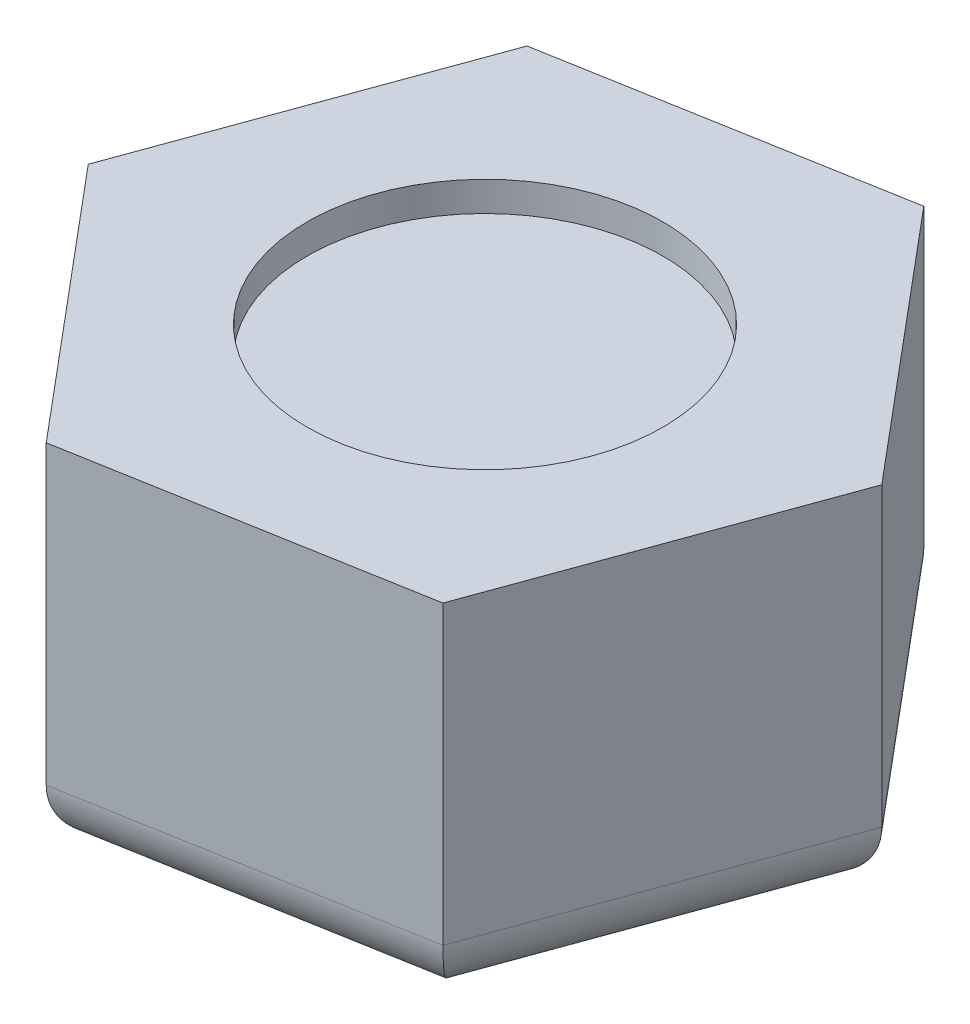
ISO-10303-21;
HEADER;
FILE_DESCRIPTION(('STEP AP214'),'2;1');
FILE_NAME('part.step','',(''),(''),'','','');
FILE_SCHEMA(('AUTOMOTIVE_DESIGN { 1 0 10303 214 1 1 1 1 }'));
ENDSEC;
DATA;
#1=APPLICATION_CONTEXT('core data for automotive mechanical design processes');
#2=APPLICATION_PROTOCOL_DEFINITION('international standard','automotive_design',2000,#1);
#3=PRODUCT_CONTEXT('',#1,'mechanical');
#4=PRODUCT('Part','Part','',(#3));
#5=PRODUCT_RELATED_PRODUCT_CATEGORY('part','',(#4));
#6=PRODUCT_DEFINITION_FORMATION('','',#4);
#7=PRODUCT_DEFINITION_CONTEXT('part definition',#1,'design');
#8=PRODUCT_DEFINITION('design','',#6,#7);
#9=PRODUCT_DEFINITION_SHAPE('','',#8);
#10=(LENGTH_UNIT() NAMED_UNIT(*) SI_UNIT(.MILLI.,.METRE.));
#11=(NAMED_UNIT(*) PLANE_ANGLE_UNIT() SI_UNIT($,.RADIAN.));
#12=(NAMED_UNIT(*) SI_UNIT($,.STERADIAN.) SOLID_ANGLE_UNIT());
#13=UNCERTAINTY_MEASURE_WITH_UNIT(LENGTH_MEASURE(1.E-05),#10,'distance_accuracy_value','');
#14=(GEOMETRIC_REPRESENTATION_CONTEXT(3) GLOBAL_UNCERTAINTY_ASSIGNED_CONTEXT((#13)) GLOBAL_UNIT_ASSIGNED_CONTEXT((#10,
#11,#12)) REPRESENTATION_CONTEXT('',''));
#15=CARTESIAN_POINT('',(0.,0.,0.));
#16=DIRECTION('',(0.,0.,1.));
#17=DIRECTION('',(1.,0.,0.));
#18=AXIS2_PLACEMENT_3D('',#15,#16,#17);
#19=CARTESIAN_POINT('',(-1972.4065153203,6000.,5426.13544538425));
#20=DIRECTION('',(-0.17405613670975,0.,-0.98473573169337));
#21=DIRECTION('',(-0.98473573169337,0.,0.17405613670975));
#22=AXIS2_PLACEMENT_3D('',#19,#20,#21);
#23=PLANE('',#22);
#24=DIRECTION('',(0.,-1.,0.));
#25=VECTOR('',#24,1.);
#26=CARTESIAN_POINT('',(-1972.4065153203,6000.,5426.13544538425));
#27=LINE('',#26,#25);
#28=CARTESIAN_POINT('',(-1972.4065153203,6000.,5426.13544538425));
#29=VERTEX_POINT('',#28);
#30=CARTESIAN_POINT('',(-1972.4065153203,1000.,5426.13544538425));
#31=VERTEX_POINT('',#30);
#32=EDGE_CURVE('E204',#29,#31,#27,.T.);
#33=ORIENTED_EDGE('',*,*,#32,.T.);
#34=DIRECTION('',(0.98473573169337,0.,-0.17405613670975));
#35=VECTOR('',#34,1.);
#36=CARTESIAN_POINT('',(-1972.4065153203,1000.,5426.13544538425));
#37=LINE('',#36,#35);
#38=CARTESIAN_POINT('',(3712.9678824178,1000.,4421.22187154945));
#39=VERTEX_POINT('',#38);
#40=EDGE_CURVE('E13',#31,#39,#37,.T.);
#41=ORIENTED_EDGE('',*,*,#40,.T.);
#42=DIRECTION('',(0.,-1.,0.));
#43=VECTOR('',#42,1.);
#44=CARTESIAN_POINT('',(3712.9678824178,6000.,4421.22187154945));
#45=LINE('',#44,#43);
#46=CARTESIAN_POINT('',(3712.9678824178,6000.,4421.22187154945));
#47=VERTEX_POINT('',#46);
#48=EDGE_CURVE('E117',#47,#39,#45,.T.);
#49=ORIENTED_EDGE('',*,*,#48,.F.);
#50=DIRECTION('',(0.98473573169337,0.,-0.17405613670975));
#51=VECTOR('',#50,1.);
#52=CARTESIAN_POINT('',(-1972.4065153203,6000.,5426.13544538425));
#53=LINE('',#52,#51);
#54=EDGE_CURVE('E122',#29,#47,#53,.T.);
#55=ORIENTED_EDGE('',*,*,#54,.F.);
#56=EDGE_LOOP('',(#33,#41,#49,#55));
#57=FACE_BOUND('',#56,.T.);
#58=ADVANCED_FACE('F44',(#57),#23,.F.);
#59=CARTESIAN_POINT('',(3712.9678824178,6000.,4421.22187154945));
#60=DIRECTION('',(-0.93983422801559,0.,-0.341630829771464));
#61=DIRECTION('',(-0.341630829771464,0.,0.939834228015591));
#62=AXIS2_PLACEMENT_3D('',#59,#60,#61);
#63=PLANE('',#62);
#64=ORIENTED_EDGE('',*,*,#48,.T.);
#65=DIRECTION('',(0.341630829771464,0.,-0.939834228015591));
#66=VECTOR('',#65,1.);
#67=CARTESIAN_POINT('',(3712.9678824178,1000.,4421.22187154945));
#68=LINE('',#67,#66);
#69=CARTESIAN_POINT('',(5685.3743977381,1000.,-1004.91357383481));
#70=VERTEX_POINT('',#69);
#71=EDGE_CURVE('E53',#39,#70,#68,.T.);
#72=ORIENTED_EDGE('',*,*,#71,.T.);
#73=DIRECTION('',(0.,-1.,0.));
#74=VECTOR('',#73,1.);
#75=CARTESIAN_POINT('',(5685.3743977381,6000.,-1004.91357383481));
#76=LINE('',#75,#74);
#77=CARTESIAN_POINT('',(5685.3743977381,6000.,-1004.91357383481));
#78=VERTEX_POINT('',#77);
#79=EDGE_CURVE('E118',#78,#70,#76,.T.);
#80=ORIENTED_EDGE('',*,*,#79,.F.);
#81=DIRECTION('',(0.341630829771464,0.,-0.939834228015591));
#82=VECTOR('',#81,1.);
#83=CARTESIAN_POINT('',(3712.9678824178,6000.,4421.22187154945));
#84=LINE('',#83,#82);
#85=EDGE_CURVE('E114',#47,#78,#84,.T.);
#86=ORIENTED_EDGE('',*,*,#85,.F.);
#87=EDGE_LOOP('',(#64,#72,#80,#86));
#88=FACE_BOUND('',#87,.T.);
#89=ADVANCED_FACE('F116',(#88),#63,.F.);
#90=CARTESIAN_POINT('',(5685.3743977381,6000.,-1004.91357383481));
#91=DIRECTION('',(-0.76577809130584,0.,0.643104901921906));
#92=DIRECTION('',(0.643104901921906,0.,0.76577809130584));
#93=AXIS2_PLACEMENT_3D('',#90,#91,#92);
#94=PLANE('',#93);
#95=ORIENTED_EDGE('',*,*,#79,.T.);
#96=DIRECTION('',(-0.643104901921906,0.,-0.76577809130584));
#97=VECTOR('',#96,1.);
#98=CARTESIAN_POINT('',(5685.3743977381,1000.,-1004.91357383481));
#99=LINE('',#98,#97);
#100=CARTESIAN_POINT('',(1972.4065153203,1000.,-5426.13544538425));
#101=VERTEX_POINT('',#100);
#102=EDGE_CURVE('E155',#70,#101,#99,.T.);
#103=ORIENTED_EDGE('',*,*,#102,.T.);
#104=DIRECTION('',(0.,-1.,0.));
#105=VECTOR('',#104,1.);
#106=CARTESIAN_POINT('',(1972.4065153203,6000.,-5426.13544538425));
#107=LINE('',#106,#105);
#108=CARTESIAN_POINT('',(1972.4065153203,6000.,-5426.13544538425));
#109=VERTEX_POINT('',#108);
#110=EDGE_CURVE('E135',#109,#101,#107,.T.);
#111=ORIENTED_EDGE('',*,*,#110,.F.);
#112=DIRECTION('',(-0.643104901921906,0.,-0.76577809130584));
#113=VECTOR('',#112,1.);
#114=CARTESIAN_POINT('',(5685.3743977381,6000.,-1004.91357383481));
#115=LINE('',#114,#113);
#116=EDGE_CURVE('E121',#78,#109,#115,.T.);
#117=ORIENTED_EDGE('',*,*,#116,.F.);
#118=EDGE_LOOP('',(#95,#103,#111,#117));
#119=FACE_BOUND('',#118,.T.);
#120=ADVANCED_FACE('F216',(#119),#94,.F.);
#121=CARTESIAN_POINT('',(1972.4065153203,6000.,-5426.13544538425));
#122=DIRECTION('',(0.17405613670975,0.,0.98473573169337));
#123=DIRECTION('',(0.98473573169337,0.,-0.17405613670975));
#124=AXIS2_PLACEMENT_3D('',#121,#122,#123);
#125=PLANE('',#124);
#126=ORIENTED_EDGE('',*,*,#110,.T.);
#127=DIRECTION('',(-0.98473573169337,0.,0.17405613670975));
#128=VECTOR('',#127,1.);
#129=CARTESIAN_POINT('',(1972.4065153203,1000.,-5426.13544538425));
#130=LINE('',#129,#128);
#131=CARTESIAN_POINT('',(-3712.9678824178,1000.,-4421.22187154945));
#132=VERTEX_POINT('',#131);
#133=EDGE_CURVE('E153',#101,#132,#130,.T.);
#134=ORIENTED_EDGE('',*,*,#133,.T.);
#135=DIRECTION('',(0.,-1.,0.));
#136=VECTOR('',#135,1.);
#137=CARTESIAN_POINT('',(-3712.9678824178,6000.,-4421.22187154945));
#138=LINE('',#137,#136);
#139=CARTESIAN_POINT('',(-3712.9678824178,6000.,-4421.22187154945));
#140=VERTEX_POINT('',#139);
#141=EDGE_CURVE('E201',#140,#132,#138,.T.);
#142=ORIENTED_EDGE('',*,*,#141,.F.);
#143=DIRECTION('',(-0.98473573169337,0.,0.17405613670975));
#144=VECTOR('',#143,1.);
#145=CARTESIAN_POINT('',(1972.4065153203,6000.,-5426.13544538425));
#146=LINE('',#145,#144);
#147=EDGE_CURVE('E214',#109,#140,#146,.T.);
#148=ORIENTED_EDGE('',*,*,#147,.F.);
#149=EDGE_LOOP('',(#126,#134,#142,#148));
#150=FACE_BOUND('',#149,.T.);
#151=ADVANCED_FACE('F213',(#150),#125,.F.);
#152=CARTESIAN_POINT('',(-3712.9678824178,6000.,-4421.22187154945));
#153=DIRECTION('',(0.93983422801559,0.,0.341630829771464));
#154=DIRECTION('',(0.341630829771464,0.,-0.93983422801559));
#155=AXIS2_PLACEMENT_3D('',#152,#153,#154);
#156=PLANE('',#155);
#157=ORIENTED_EDGE('',*,*,#141,.T.);
#158=DIRECTION('',(-0.341630829771464,0.,0.93983422801559));
#159=VECTOR('',#158,1.);
#160=CARTESIAN_POINT('',(-3712.9678824178,1000.,-4421.22187154945));
#161=LINE('',#160,#159);
#162=CARTESIAN_POINT('',(-5685.3743977381,1000.,1004.91357383481));
#163=VERTEX_POINT('',#162);
#164=EDGE_CURVE('E151',#132,#163,#161,.T.);
#165=ORIENTED_EDGE('',*,*,#164,.T.);
#166=DIRECTION('',(0.,-1.,0.));
#167=VECTOR('',#166,1.);
#168=CARTESIAN_POINT('',(-5685.3743977381,6000.,1004.91357383481));
#169=LINE('',#168,#167);
#170=CARTESIAN_POINT('',(-5685.3743977381,6000.,1004.91357383481));
#171=VERTEX_POINT('',#170);
#172=EDGE_CURVE('E199',#171,#163,#169,.T.);
#173=ORIENTED_EDGE('',*,*,#172,.F.);
#174=DIRECTION('',(-0.341630829771464,0.,0.93983422801559));
#175=VECTOR('',#174,1.);
#176=CARTESIAN_POINT('',(-3712.9678824178,6000.,-4421.22187154945));
#177=LINE('',#176,#175);
#178=EDGE_CURVE('E218',#140,#171,#177,.T.);
#179=ORIENTED_EDGE('',*,*,#178,.F.);
#180=EDGE_LOOP('',(#157,#165,#173,#179));
#181=FACE_BOUND('',#180,.T.);
#182=ADVANCED_FACE('F197',(#181),#156,.F.);
#183=CARTESIAN_POINT('',(-5685.3743977381,6000.,1004.91357383481));
#184=DIRECTION('',(0.76577809130584,0.,-0.643104901921906));
#185=DIRECTION('',(-0.643104901921906,0.,-0.76577809130584));
#186=AXIS2_PLACEMENT_3D('',#183,#184,#185);
#187=PLANE('',#186);
#188=ORIENTED_EDGE('',*,*,#172,.T.);
#189=DIRECTION('',(0.643104901921906,0.,0.76577809130584));
#190=VECTOR('',#189,1.);
#191=CARTESIAN_POINT('',(-5685.3743977381,1000.,1004.91357383481));
#192=LINE('',#191,#190);
#193=EDGE_CURVE('E130',#163,#31,#192,.T.);
#194=ORIENTED_EDGE('',*,*,#193,.T.);
#195=ORIENTED_EDGE('',*,*,#32,.F.);
#196=DIRECTION('',(0.643104901921906,0.,0.76577809130584));
#197=VECTOR('',#196,1.);
#198=CARTESIAN_POINT('',(-5685.3743977381,6000.,1004.91357383481));
#199=LINE('',#198,#197);
#200=EDGE_CURVE('E127',#171,#29,#199,.T.);
#201=ORIENTED_EDGE('',*,*,#200,.F.);
#202=EDGE_LOOP('',(#188,#194,#195,#201));
#203=FACE_BOUND('',#202,.T.);
#204=ADVANCED_FACE('F203',(#203),#187,.F.);
#205=CARTESIAN_POINT('',(0.,6000.,0.));
#206=DIRECTION('',(0.,1.,0.));
#207=DIRECTION('',(0.,0.,1.));
#208=AXIS2_PLACEMENT_3D('',#205,#206,#207);
#209=PLANE('',#208);
#210=CARTESIAN_POINT('',(0.,6000.,0.));
#211=DIRECTION('',(0.,1.,0.));
#212=DIRECTION('',(0.,0.,1.));
#213=AXIS2_PLACEMENT_3D('',#210,#211,#212);
#214=CIRCLE('',#213,3000.);
#215=CARTESIAN_POINT('',(0.,6000.,3000.));
#216=VERTEX_POINT('',#215);
#217=EDGE_CURVE('E222',#216,#216,#214,.T.);
#218=ORIENTED_EDGE('',*,*,#217,.F.);
#219=EDGE_LOOP('',(#218));
#220=FACE_BOUND('',#219,.T.);
#221=ORIENTED_EDGE('',*,*,#54,.T.);
#222=ORIENTED_EDGE('',*,*,#85,.T.);
#223=ORIENTED_EDGE('',*,*,#116,.T.);
#224=ORIENTED_EDGE('',*,*,#147,.T.);
#225=ORIENTED_EDGE('',*,*,#178,.T.);
#226=ORIENTED_EDGE('',*,*,#200,.T.);
#227=EDGE_LOOP('',(#221,#222,#223,#224,#225,#226));
#228=FACE_BOUND('',#227,.T.);
#229=ADVANCED_FACE('F125',(#220,#228),#209,.T.);
#230=CARTESIAN_POINT('',(0.,0.,0.));
#231=DIRECTION('',(0.,1.,0.));
#232=DIRECTION('',(0.,0.,1.));
#233=AXIS2_PLACEMENT_3D('',#230,#231,#232);
#234=PLANE('',#233);
#235=DIRECTION('',(0.98473573169337,0.,-0.17405613670975));
#236=VECTOR('',#235,1.);
#237=CARTESIAN_POINT('',(696.224546839001,0.,3938.94292677348));
#238=LINE('',#237,#236);
#239=CARTESIAN_POINT('',(2970.37430593424,0.,3536.97749723956));
#240=VERTEX_POINT('',#239);
#241=CARTESIAN_POINT('',(-1577.92521225624,0.,4340.9083563074));
#242=VERTEX_POINT('',#241);
#243=EDGE_CURVE('E133',#240,#242,#238,.F.);
#244=ORIENTED_EDGE('',*,*,#243,.T.);
#245=DIRECTION('',(0.643104901921906,0.,0.76577809130584));
#246=VECTOR('',#245,1.);
#247=CARTESIAN_POINT('',(-3063.11236522336,0.,2572.41960768762));
#248=LINE('',#247,#246);
#249=CARTESIAN_POINT('',(-4548.29951819048,0.,803.930859067846));
#250=VERTEX_POINT('',#249);
#251=EDGE_CURVE('E148',#242,#250,#248,.F.);
#252=ORIENTED_EDGE('',*,*,#251,.T.);
#253=DIRECTION('',(-0.341630829771464,0.,0.93983422801559));
#254=VECTOR('',#253,1.);
#255=CARTESIAN_POINT('',(-3759.33691206236,0.,-1366.52331908586));
#256=LINE('',#255,#254);
#257=CARTESIAN_POINT('',(-2970.37430593424,0.,-3536.97749723956));
#258=VERTEX_POINT('',#257);
#259=EDGE_CURVE('E146',#250,#258,#256,.F.);
#260=ORIENTED_EDGE('',*,*,#259,.T.);
#261=DIRECTION('',(-0.98473573169337,0.,0.17405613670975));
#262=VECTOR('',#261,1.);
#263=CARTESIAN_POINT('',(-696.224546839,0.,-3938.94292677348));
#264=LINE('',#263,#262);
#265=CARTESIAN_POINT('',(1577.92521225624,0.,-4340.9083563074));
#266=VERTEX_POINT('',#265);
#267=EDGE_CURVE('E144',#258,#266,#264,.F.);
#268=ORIENTED_EDGE('',*,*,#267,.T.);
#269=DIRECTION('',(-0.643104901921906,0.,-0.76577809130584));
#270=VECTOR('',#269,1.);
#271=CARTESIAN_POINT('',(3063.11236522336,0.,-2572.41960768762));
#272=LINE('',#271,#270);
#273=CARTESIAN_POINT('',(4548.29951819048,0.,-803.930859067846));
#274=VERTEX_POINT('',#273);
#275=EDGE_CURVE('E142',#266,#274,#272,.F.);
#276=ORIENTED_EDGE('',*,*,#275,.T.);
#277=DIRECTION('',(0.341630829771464,0.,-0.939834228015591));
#278=VECTOR('',#277,1.);
#279=CARTESIAN_POINT('',(3759.33691206236,0.,1366.52331908586));
#280=LINE('',#279,#278);
#281=EDGE_CURVE('E140',#274,#240,#280,.F.);
#282=ORIENTED_EDGE('',*,*,#281,.T.);
#283=EDGE_LOOP('',(#244,#252,#260,#268,#276,#282));
#284=FACE_BOUND('',#283,.T.);
#285=ADVANCED_FACE('F184',(#284),#234,.F.);
#286=CARTESIAN_POINT('',(4919.59630643226,1000.,-361.808671912901));
#287=DIRECTION('',(-0.643104901921906,0.,-0.76577809130584));
#288=DIRECTION('',(-0.76577809130584,0.,0.643104901921906));
#289=AXIS2_PLACEMENT_3D('',#286,#287,#288);
#290=CYLINDRICAL_SURFACE('',#289,1000.);
#291=CARTESIAN_POINT('',(4548.29951819048,1000.,-803.930859067845));
#292=DIRECTION('',(-0.17405613670975,0.,-0.98473573169337));
#293=DIRECTION('',(0.98473573169337,0.,-0.17405613670975));
#294=AXIS2_PLACEMENT_3D('',#291,#292,#293);
#295=ELLIPSE('',#294,1154.70053837925,1000.);
#296=EDGE_CURVE('E168',#274,#70,#295,.F.);
#297=ORIENTED_EDGE('',*,*,#296,.F.);
#298=ORIENTED_EDGE('',*,*,#275,.F.);
#299=CARTESIAN_POINT('',(1577.92521225624,1000.,-4340.9083563074));
#300=DIRECTION('',(-0.93983422801559,0.,-0.341630829771464));
#301=DIRECTION('',(0.341630829771464,0.,-0.939834228015591));
#302=AXIS2_PLACEMENT_3D('',#299,#300,#301);
#303=ELLIPSE('',#302,1154.70053837925,1000.);
#304=EDGE_CURVE('E48',#101,#266,#303,.T.);
#305=ORIENTED_EDGE('',*,*,#304,.F.);
#306=ORIENTED_EDGE('',*,*,#102,.F.);
#307=EDGE_LOOP('',(#297,#298,#305,#306));
#308=FACE_BOUND('',#307,.T.);
#309=ADVANCED_FACE('F46',(#308),#290,.T.);
#310=CARTESIAN_POINT('',(2146.46265203005,1000.,-4441.39971369088));
#311=DIRECTION('',(-0.98473573169337,0.,0.17405613670975));
#312=DIRECTION('',(0.17405613670975,0.,0.98473573169337));
#313=AXIS2_PLACEMENT_3D('',#310,#311,#312);
#314=CYLINDRICAL_SURFACE('',#313,1000.);
#315=ORIENTED_EDGE('',*,*,#304,.T.);
#316=ORIENTED_EDGE('',*,*,#267,.F.);
#317=CARTESIAN_POINT('',(-2970.37430593424,1000.,-3536.97749723956));
#318=DIRECTION('',(-0.76577809130584,0.,0.643104901921906));
#319=DIRECTION('',(-0.643104901921906,0.,-0.76577809130584));
#320=AXIS2_PLACEMENT_3D('',#317,#318,#319);
#321=ELLIPSE('',#320,1154.70053837925,1000.);
#322=EDGE_CURVE('E166',#132,#258,#321,.T.);
#323=ORIENTED_EDGE('',*,*,#322,.F.);
#324=ORIENTED_EDGE('',*,*,#133,.F.);
#325=EDGE_LOOP('',(#315,#316,#323,#324));
#326=FACE_BOUND('',#325,.T.);
#327=ADVANCED_FACE('F178',(#326),#314,.T.);
#328=CARTESIAN_POINT('',(2773.13365440221,1000.,4079.59104177798));
#329=DIRECTION('',(0.341630829771464,0.,-0.939834228015591));
#330=DIRECTION('',(-0.939834228015591,0.,-0.341630829771464));
#331=AXIS2_PLACEMENT_3D('',#328,#329,#330);
#332=CYLINDRICAL_SURFACE('',#331,1000.);
#333=ORIENTED_EDGE('',*,*,#296,.T.);
#334=ORIENTED_EDGE('',*,*,#71,.F.);
#335=CARTESIAN_POINT('',(2970.37430593424,1000.,3536.97749723956));
#336=DIRECTION('',(0.76577809130584,0.,-0.643104901921906));
#337=DIRECTION('',(0.643104901921906,0.,0.76577809130584));
#338=AXIS2_PLACEMENT_3D('',#335,#336,#337);
#339=ELLIPSE('',#338,1154.70053837925,1000.);
#340=EDGE_CURVE('E163',#240,#39,#339,.F.);
#341=ORIENTED_EDGE('',*,*,#340,.F.);
#342=ORIENTED_EDGE('',*,*,#281,.F.);
#343=EDGE_LOOP('',(#333,#334,#341,#342));
#344=FACE_BOUND('',#343,.T.);
#345=ADVANCED_FACE('F262',(#344),#332,.T.);
#346=CARTESIAN_POINT('',(-2773.13365440221,1000.,-4079.59104177798));
#347=DIRECTION('',(-0.341630829771464,0.,0.93983422801559));
#348=DIRECTION('',(0.93983422801559,0.,0.341630829771464));
#349=AXIS2_PLACEMENT_3D('',#346,#347,#348);
#350=CYLINDRICAL_SURFACE('',#349,1000.);
#351=ORIENTED_EDGE('',*,*,#322,.T.);
#352=ORIENTED_EDGE('',*,*,#259,.F.);
#353=CARTESIAN_POINT('',(-4548.29951819048,1000.,803.930859067845));
#354=DIRECTION('',(0.17405613670975,0.,0.98473573169337));
#355=DIRECTION('',(-0.98473573169337,0.,0.17405613670975));
#356=AXIS2_PLACEMENT_3D('',#353,#354,#355);
#357=ELLIPSE('',#356,1154.70053837925,1000.);
#358=EDGE_CURVE('E160',#163,#250,#357,.T.);
#359=ORIENTED_EDGE('',*,*,#358,.F.);
#360=ORIENTED_EDGE('',*,*,#164,.F.);
#361=EDGE_LOOP('',(#351,#352,#359,#360));
#362=FACE_BOUND('',#361,.T.);
#363=ADVANCED_FACE('F190',(#362),#350,.T.);
#364=CARTESIAN_POINT('',(-2146.46265203005,1000.,4441.39971369088));
#365=DIRECTION('',(0.98473573169337,0.,-0.17405613670975));
#366=DIRECTION('',(-0.17405613670975,0.,-0.98473573169337));
#367=AXIS2_PLACEMENT_3D('',#364,#365,#366);
#368=CYLINDRICAL_SURFACE('',#367,1000.);
#369=ORIENTED_EDGE('',*,*,#340,.T.);
#370=ORIENTED_EDGE('',*,*,#40,.F.);
#371=CARTESIAN_POINT('',(-1577.92521225624,1000.,4340.9083563074));
#372=DIRECTION('',(0.939834228015591,0.,0.341630829771464));
#373=DIRECTION('',(0.341630829771464,0.,-0.93983422801559));
#374=AXIS2_PLACEMENT_3D('',#371,#372,#373);
#375=ELLIPSE('',#374,1154.70053837925,1000.);
#376=EDGE_CURVE('E158',#242,#31,#375,.F.);
#377=ORIENTED_EDGE('',*,*,#376,.F.);
#378=ORIENTED_EDGE('',*,*,#243,.F.);
#379=EDGE_LOOP('',(#369,#370,#377,#378));
#380=FACE_BOUND('',#379,.T.);
#381=ADVANCED_FACE('F255',(#380),#368,.T.);
#382=CARTESIAN_POINT('',(-4919.59630643226,1000.,361.808671912901));
#383=DIRECTION('',(0.643104901921906,0.,0.76577809130584));
#384=DIRECTION('',(0.76577809130584,0.,-0.643104901921906));
#385=AXIS2_PLACEMENT_3D('',#382,#383,#384);
#386=CYLINDRICAL_SURFACE('',#385,1000.);
#387=ORIENTED_EDGE('',*,*,#358,.T.);
#388=ORIENTED_EDGE('',*,*,#251,.F.);
#389=ORIENTED_EDGE('',*,*,#376,.T.);
#390=ORIENTED_EDGE('',*,*,#193,.F.);
#391=EDGE_LOOP('',(#387,#388,#389,#390));
#392=FACE_BOUND('',#391,.T.);
#393=ADVANCED_FACE('F233',(#392),#386,.T.);
#394=CARTESIAN_POINT('',(0.,5500.,0.));
#395=DIRECTION('',(0.,1.,0.));
#396=DIRECTION('',(0.,0.,1.));
#397=AXIS2_PLACEMENT_3D('',#394,#395,#396);
#398=CYLINDRICAL_SURFACE('',#397,3000.);
#399=CARTESIAN_POINT('',(0.,5500.,0.));
#400=DIRECTION('',(0.,1.,0.));
#401=DIRECTION('',(0.,0.,1.));
#402=AXIS2_PLACEMENT_3D('',#399,#400,#401);
#403=CIRCLE('',#402,3000.);
#404=CARTESIAN_POINT('',(0.,5500.,3000.));
#405=VERTEX_POINT('',#404);
#406=EDGE_CURVE('E161',#405,#405,#403,.T.);
#407=ORIENTED_EDGE('',*,*,#406,.F.);
#408=EDGE_LOOP('',(#407));
#409=FACE_BOUND('',#408,.T.);
#410=ORIENTED_EDGE('',*,*,#217,.T.);
#411=EDGE_LOOP('',(#410));
#412=FACE_BOUND('',#411,.T.);
#413=ADVANCED_FACE('F230',(#409,#412),#398,.F.);
#414=CARTESIAN_POINT('',(0.,5500.,0.));
#415=DIRECTION('',(0.,1.,0.));
#416=DIRECTION('',(0.,0.,1.));
#417=AXIS2_PLACEMENT_3D('',#414,#415,#416);
#418=PLANE('',#417);
#419=ORIENTED_EDGE('',*,*,#406,.T.);
#420=EDGE_LOOP('',(#419));
#421=FACE_BOUND('',#420,.T.);
#422=ADVANCED_FACE('F228',(#421),#418,.T.);
#423=CLOSED_SHELL('',(#58,#89,#120,#151,#182,#204,#229,#285,#309,#327,#345,#363,#381,#393,#413,#422));
#424=MANIFOLD_SOLID_BREP('B2',#423);
#425=ADVANCED_BREP_SHAPE_REPRESENTATION('',(#18,#424),#14);
#426=SHAPE_DEFINITION_REPRESENTATION(#9,#425);
ENDSEC;
END-ISO-10303-21;
